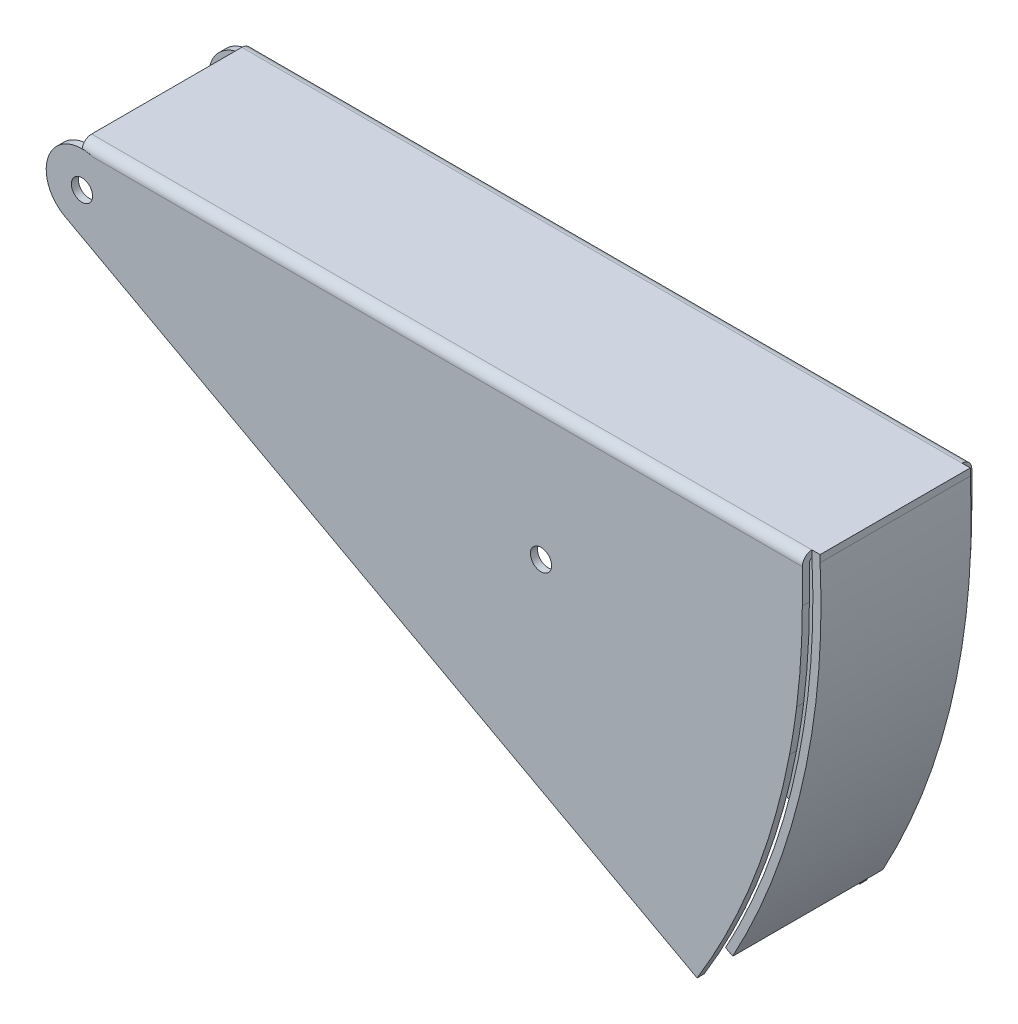
ISO-10303-21;
HEADER;
FILE_DESCRIPTION(('STEP AP214'),'2;1');
FILE_NAME('part.step','',(''),(''),'','','');
FILE_SCHEMA(('AUTOMOTIVE_DESIGN { 1 0 10303 214 1 1 1 1 }'));
ENDSEC;
DATA;
#1=APPLICATION_CONTEXT('core data for automotive mechanical design processes');
#2=APPLICATION_PROTOCOL_DEFINITION('international standard','automotive_design',2000,#1);
#3=PRODUCT_CONTEXT('',#1,'mechanical');
#4=PRODUCT('Part','Part','',(#3));
#5=PRODUCT_RELATED_PRODUCT_CATEGORY('part','',(#4));
#6=PRODUCT_DEFINITION_FORMATION('','',#4);
#7=PRODUCT_DEFINITION_CONTEXT('part definition',#1,'design');
#8=PRODUCT_DEFINITION('design','',#6,#7);
#9=PRODUCT_DEFINITION_SHAPE('','',#8);
#10=(LENGTH_UNIT() NAMED_UNIT(*) SI_UNIT(.MILLI.,.METRE.));
#11=(NAMED_UNIT(*) PLANE_ANGLE_UNIT() SI_UNIT($,.RADIAN.));
#12=(NAMED_UNIT(*) SI_UNIT($,.STERADIAN.) SOLID_ANGLE_UNIT());
#13=UNCERTAINTY_MEASURE_WITH_UNIT(LENGTH_MEASURE(1.E-05),#10,'distance_accuracy_value','');
#14=(GEOMETRIC_REPRESENTATION_CONTEXT(3) GLOBAL_UNCERTAINTY_ASSIGNED_CONTEXT((#13)) GLOBAL_UNIT_ASSIGNED_CONTEXT((#10,
#11,#12)) REPRESENTATION_CONTEXT('',''));
#15=CARTESIAN_POINT('',(0.,0.,0.));
#16=DIRECTION('',(0.,0.,1.));
#17=DIRECTION('',(1.,0.,0.));
#18=AXIS2_PLACEMENT_3D('',#15,#16,#17);
#19=CARTESIAN_POINT('',(0.,-2.,0.));
#20=DIRECTION('',(0.,-1.,0.));
#21=DIRECTION('',(0.,0.,-1.));
#22=AXIS2_PLACEMENT_3D('',#19,#20,#21);
#23=PLANE('',#22);
#24=DIRECTION('',(0.,0.,-1.));
#25=VECTOR('',#24,1.);
#26=CARTESIAN_POINT('',(134.,-2.,134.559141912843));
#27=LINE('',#26,#25);
#28=CARTESIAN_POINT('',(134.,-1.99999999999906,21.2634));
#29=VERTEX_POINT('',#28);
#30=CARTESIAN_POINT('',(134.,-1.99999999999973,-21.2634));
#31=VERTEX_POINT('',#30);
#32=EDGE_CURVE('E258',#29,#31,#27,.T.);
#33=ORIENTED_EDGE('',*,*,#32,.F.);
#34=DIRECTION('',(-1.,0.,0.));
#35=VECTOR('',#34,1.);
#36=CARTESIAN_POINT('',(-70.,-2.,21.2634));
#37=LINE('',#36,#35);
#38=CARTESIAN_POINT('',(-70.,-2.,21.2634));
#39=VERTEX_POINT('',#38);
#40=EDGE_CURVE('E509',#39,#29,#37,.F.);
#41=ORIENTED_EDGE('',*,*,#40,.F.);
#42=DIRECTION('',(0.,0.,1.));
#43=VECTOR('',#42,1.);
#44=CARTESIAN_POINT('',(-70.,-2.,-24.));
#45=LINE('',#44,#43);
#46=CARTESIAN_POINT('',(-70.,-2.00000000000001,-21.2634));
#47=VERTEX_POINT('',#46);
#48=EDGE_CURVE('E517',#47,#39,#45,.T.);
#49=ORIENTED_EDGE('',*,*,#48,.F.);
#50=DIRECTION('',(1.,0.,0.));
#51=VECTOR('',#50,1.);
#52=CARTESIAN_POINT('',(70.,-2.00000000000001,-21.2634));
#53=LINE('',#52,#51);
#54=EDGE_CURVE('E489',#31,#47,#53,.F.);
#55=ORIENTED_EDGE('',*,*,#54,.F.);
#56=EDGE_LOOP('',(#33,#41,#49,#55));
#57=FACE_BOUND('',#56,.T.);
#58=ADVANCED_FACE('F81',(#57),#23,.T.);
#59=CARTESIAN_POINT('',(0.,0.,0.));
#60=DIRECTION('',(0.,-1.,0.));
#61=DIRECTION('',(0.,0.,-1.));
#62=AXIS2_PLACEMENT_3D('',#59,#60,#61);
#63=PLANE('',#62);
#64=DIRECTION('',(0.,0.,-1.));
#65=VECTOR('',#64,1.);
#66=CARTESIAN_POINT('',(136.301141627899,0.,0.));
#67=LINE('',#66,#65);
#68=CARTESIAN_POINT('',(136.301141627899,0.,21.2634));
#69=VERTEX_POINT('',#68);
#70=CARTESIAN_POINT('',(136.301141627899,0.,-21.2634));
#71=VERTEX_POINT('',#70);
#72=EDGE_CURVE('E276',#69,#71,#67,.T.);
#73=ORIENTED_EDGE('',*,*,#72,.T.);
#74=DIRECTION('',(-1.,0.,0.));
#75=VECTOR('',#74,1.);
#76=CARTESIAN_POINT('',(70.,0.,-21.2634));
#77=LINE('',#76,#75);
#78=CARTESIAN_POINT('',(134.,0.,-21.2634));
#79=VERTEX_POINT('',#78);
#80=EDGE_CURVE('E365',#71,#79,#77,.T.);
#81=ORIENTED_EDGE('',*,*,#80,.T.);
#82=DIRECTION('',(1.,0.,0.));
#83=VECTOR('',#82,1.);
#84=CARTESIAN_POINT('',(70.,0.,-21.2634));
#85=LINE('',#84,#83);
#86=CARTESIAN_POINT('',(-70.,0.,-21.2634));
#87=VERTEX_POINT('',#86);
#88=EDGE_CURVE('E479',#79,#87,#85,.F.);
#89=ORIENTED_EDGE('',*,*,#88,.T.);
#90=DIRECTION('',(0.,0.,1.));
#91=VECTOR('',#90,1.);
#92=CARTESIAN_POINT('',(-70.,0.,-24.));
#93=LINE('',#92,#91);
#94=CARTESIAN_POINT('',(-70.,0.,21.2634));
#95=VERTEX_POINT('',#94);
#96=EDGE_CURVE('E516',#87,#95,#93,.T.);
#97=ORIENTED_EDGE('',*,*,#96,.T.);
#98=DIRECTION('',(-1.,0.,0.));
#99=VECTOR('',#98,1.);
#100=CARTESIAN_POINT('',(-70.,0.,21.2634));
#101=LINE('',#100,#99);
#102=CARTESIAN_POINT('',(134.,0.,21.2634));
#103=VERTEX_POINT('',#102);
#104=EDGE_CURVE('E504',#95,#103,#101,.F.);
#105=ORIENTED_EDGE('',*,*,#104,.T.);
#106=DIRECTION('',(1.,0.,0.));
#107=VECTOR('',#106,1.);
#108=CARTESIAN_POINT('',(70.,0.,21.2634));
#109=LINE('',#108,#107);
#110=EDGE_CURVE('E364',#103,#69,#109,.T.);
#111=ORIENTED_EDGE('',*,*,#110,.T.);
#112=EDGE_LOOP('',(#73,#81,#89,#97,#105,#111));
#113=FACE_BOUND('',#112,.T.);
#114=ADVANCED_FACE('F453',(#113),#63,.F.);
#115=CARTESIAN_POINT('',(70.,-92.6009311113302,21.2634));
#116=DIRECTION('',(0.,0.,1.));
#117=DIRECTION('',(1.,0.,0.));
#118=AXIS2_PLACEMENT_3D('',#115,#116,#117);
#119=PLANE('',#118);
#120=ORIENTED_EDGE('',*,*,#110,.F.);
#121=DIRECTION('',(0.,1.,0.));
#122=VECTOR('',#121,1.);
#123=CARTESIAN_POINT('',(134.,-2.,21.2634));
#124=LINE('',#123,#122);
#125=EDGE_CURVE('E346',#29,#103,#124,.T.);
#126=ORIENTED_EDGE('',*,*,#125,.F.);
#127=CARTESIAN_POINT('',(-70.,-12.3683,21.2634));
#128=DIRECTION('',(0.,0.,1.));
#129=DIRECTION('',(1.,0.,0.));
#130=AXIS2_PLACEMENT_3D('',#127,#128,#129);
#131=CIRCLE('',#130,204.263314486204);
#132=CARTESIAN_POINT('',(109.535311002089,-109.787875796004,21.2634));
#133=VERTEX_POINT('',#132);
#134=EDGE_CURVE('E251',#133,#29,#131,.T.);
#135=ORIENTED_EDGE('',*,*,#134,.F.);
#136=DIRECTION('',(-0.87894055500707,0.47693133757792,0.));
#137=VECTOR('',#136,1.);
#138=CARTESIAN_POINT('',(109.535311002089,-109.787875796004,21.2634));
#139=LINE('',#138,#137);
#140=CARTESIAN_POINT('',(111.555299451258,-110.883963338519,21.2634));
#141=VERTEX_POINT('',#140);
#142=EDGE_CURVE('E249',#141,#133,#139,.T.);
#143=ORIENTED_EDGE('',*,*,#142,.F.);
#144=CARTESIAN_POINT('',(-70.,-12.3683,21.2634));
#145=DIRECTION('',(0.,0.,1.));
#146=DIRECTION('',(1.,0.,0.));
#147=AXIS2_PLACEMENT_3D('',#144,#145,#146);
#148=CIRCLE('',#147,206.56152275258);
#149=CARTESIAN_POINT('',(136.301141627899,-2.00000000000007,21.2634));
#150=VERTEX_POINT('',#149);
#151=EDGE_CURVE('E265',#150,#141,#148,.F.);
#152=ORIENTED_EDGE('',*,*,#151,.F.);
#153=DIRECTION('',(0.,-1.,0.));
#154=VECTOR('',#153,1.);
#155=CARTESIAN_POINT('',(136.301141627899,0.,21.2634));
#156=LINE('',#155,#154);
#157=EDGE_CURVE('E279',#150,#69,#156,.F.);
#158=ORIENTED_EDGE('',*,*,#157,.T.);
#159=EDGE_LOOP('',(#120,#126,#135,#143,#152,#158));
#160=FACE_BOUND('',#159,.T.);
#161=ADVANCED_FACE('F456',(#160),#119,.T.);
#162=CARTESIAN_POINT('',(70.,-92.6009311113302,-21.2634));
#163=DIRECTION('',(0.,0.,-1.));
#164=DIRECTION('',(-1.,0.,0.));
#165=AXIS2_PLACEMENT_3D('',#162,#163,#164);
#166=PLANE('',#165);
#167=CARTESIAN_POINT('',(-70.,-12.3683,-21.2634));
#168=DIRECTION('',(0.,0.,1.));
#169=DIRECTION('',(-1.,0.,0.));
#170=AXIS2_PLACEMENT_3D('',#167,#168,#169);
#171=CIRCLE('',#170,204.263314486204);
#172=CARTESIAN_POINT('',(109.535311002089,-109.787875796004,-21.2634));
#173=VERTEX_POINT('',#172);
#174=EDGE_CURVE('E255',#173,#31,#171,.T.);
#175=ORIENTED_EDGE('',*,*,#174,.T.);
#176=DIRECTION('',(0.,-1.,0.));
#177=VECTOR('',#176,1.);
#178=CARTESIAN_POINT('',(134.,0.,-21.2634));
#179=LINE('',#178,#177);
#180=EDGE_CURVE('E362',#79,#31,#179,.T.);
#181=ORIENTED_EDGE('',*,*,#180,.F.);
#182=ORIENTED_EDGE('',*,*,#80,.F.);
#183=DIRECTION('',(0.,-1.,0.));
#184=VECTOR('',#183,1.);
#185=CARTESIAN_POINT('',(136.301141627899,0.,-21.2634));
#186=LINE('',#185,#184);
#187=CARTESIAN_POINT('',(136.301141627899,-2.,-21.2634));
#188=VERTEX_POINT('',#187);
#189=EDGE_CURVE('E281',#188,#71,#186,.F.);
#190=ORIENTED_EDGE('',*,*,#189,.F.);
#191=CARTESIAN_POINT('',(-70.,-12.3683,-21.2634));
#192=DIRECTION('',(0.,0.,-1.));
#193=DIRECTION('',(-1.,0.,0.));
#194=AXIS2_PLACEMENT_3D('',#191,#192,#193);
#195=CIRCLE('',#194,206.56152275258);
#196=CARTESIAN_POINT('',(111.555299451258,-110.883963338519,-21.2634));
#197=VERTEX_POINT('',#196);
#198=EDGE_CURVE('E96',#188,#197,#195,.T.);
#199=ORIENTED_EDGE('',*,*,#198,.T.);
#200=DIRECTION('',(-0.87894055500707,0.47693133757792,0.));
#201=VECTOR('',#200,1.);
#202=CARTESIAN_POINT('',(109.535311002089,-109.787875796004,-21.2634));
#203=LINE('',#202,#201);
#204=EDGE_CURVE('E247',#197,#173,#203,.T.);
#205=ORIENTED_EDGE('',*,*,#204,.T.);
#206=EDGE_LOOP('',(#175,#181,#182,#190,#199,#205));
#207=FACE_BOUND('',#206,.T.);
#208=ADVANCED_FACE('F263',(#207),#166,.T.);
#209=CARTESIAN_POINT('',(-70.,-12.3683,-221.668956114734));
#210=DIRECTION('',(0.,0.,1.));
#211=DIRECTION('',(1.,0.,0.));
#212=AXIS2_PLACEMENT_3D('',#209,#210,#211);
#213=CYLINDRICAL_SURFACE('',#212,204.);
#214=CARTESIAN_POINT('',(-70.,-12.3683,24.));
#215=DIRECTION('',(0.,0.,1.));
#216=DIRECTION('',(1.,0.,0.));
#217=AXIS2_PLACEMENT_3D('',#214,#215,#216);
#218=CIRCLE('',#217,204.);
#219=CARTESIAN_POINT('',(130.366665775417,-50.6984349598753,24.));
#220=VERTEX_POINT('',#219);
#221=CARTESIAN_POINT('',(132.383339124321,-37.9999999999999,24.));
#222=VERTEX_POINT('',#221);
#223=EDGE_CURVE('E324',#220,#222,#218,.T.);
#224=ORIENTED_EDGE('',*,*,#223,.F.);
#225=DIRECTION('',(0.,0.,1.));
#226=VECTOR('',#225,1.);
#227=CARTESIAN_POINT('',(130.366665775417,-50.6984349598753,-221.668956114734));
#228=LINE('',#227,#226);
#229=CARTESIAN_POINT('',(130.366665775417,-50.6984349598753,22.0000000000002));
#230=VERTEX_POINT('',#229);
#231=EDGE_CURVE('E89',#220,#230,#228,.F.);
#232=ORIENTED_EDGE('',*,*,#231,.T.);
#233=CARTESIAN_POINT('',(-70.,-12.3683,22.));
#234=DIRECTION('',(0.,0.,-1.));
#235=DIRECTION('',(0.,1.,0.));
#236=AXIS2_PLACEMENT_3D('',#233,#234,#235);
#237=CIRCLE('',#236,204.);
#238=CARTESIAN_POINT('',(132.383339124321,-37.9999999999998,22.0000000000001));
#239=VERTEX_POINT('',#238);
#240=EDGE_CURVE('E320',#230,#239,#237,.F.);
#241=ORIENTED_EDGE('',*,*,#240,.T.);
#242=DIRECTION('',(0.,0.,1.));
#243=VECTOR('',#242,1.);
#244=CARTESIAN_POINT('',(132.383339124321,-38.,-221.668956114734));
#245=LINE('',#244,#243);
#246=EDGE_CURVE('E334',#222,#239,#245,.F.);
#247=ORIENTED_EDGE('',*,*,#246,.F.);
#248=EDGE_LOOP('',(#224,#232,#241,#247));
#249=FACE_BOUND('',#248,.T.);
#250=ADVANCED_FACE('F529',(#249),#213,.T.);
#251=CARTESIAN_POINT('',(-70.,-12.3683000000009,221.668956114734));
#252=DIRECTION('',(0.,0.,-1.));
#253=DIRECTION('',(0.,1.,0.));
#254=AXIS2_PLACEMENT_3D('',#251,#252,#253);
#255=CYLINDRICAL_SURFACE('',#254,204.);
#256=CARTESIAN_POINT('',(-70.,-12.3683,-22.));
#257=DIRECTION('',(0.,0.,1.));
#258=DIRECTION('',(0.,-1.,0.));
#259=AXIS2_PLACEMENT_3D('',#256,#257,#258);
#260=CIRCLE('',#259,204.);
#261=CARTESIAN_POINT('',(132.383339124321,-38.0000000000036,-22.0000000000001));
#262=VERTEX_POINT('',#261);
#263=CARTESIAN_POINT('',(130.366665775417,-50.6984349598761,-22.0000000000002));
#264=VERTEX_POINT('',#263);
#265=EDGE_CURVE('E307',#262,#264,#260,.F.);
#266=ORIENTED_EDGE('',*,*,#265,.T.);
#267=DIRECTION('',(0.,0.,-1.));
#268=VECTOR('',#267,1.);
#269=CARTESIAN_POINT('',(130.366665775417,-50.698434959877,221.668956114734));
#270=LINE('',#269,#268);
#271=CARTESIAN_POINT('',(130.366665775417,-50.6984349598761,-24.0000000000002));
#272=VERTEX_POINT('',#271);
#273=EDGE_CURVE('E519',#264,#272,#270,.T.);
#274=ORIENTED_EDGE('',*,*,#273,.T.);
#275=CARTESIAN_POINT('',(-70.,-12.3683,-24.));
#276=DIRECTION('',(0.,0.,-1.));
#277=DIRECTION('',(0.,1.,0.));
#278=AXIS2_PLACEMENT_3D('',#275,#276,#277);
#279=CIRCLE('',#278,204.);
#280=CARTESIAN_POINT('',(132.383339124321,-37.9999999999998,-24.0000000000001));
#281=VERTEX_POINT('',#280);
#282=EDGE_CURVE('E300',#281,#272,#279,.T.);
#283=ORIENTED_EDGE('',*,*,#282,.F.);
#284=DIRECTION('',(0.,0.,-1.));
#285=VECTOR('',#284,1.);
#286=CARTESIAN_POINT('',(132.383339124321,-38.0000000000007,221.668956114734));
#287=LINE('',#286,#285);
#288=EDGE_CURVE('E316',#262,#281,#287,.T.);
#289=ORIENTED_EDGE('',*,*,#288,.F.);
#290=EDGE_LOOP('',(#266,#274,#283,#289));
#291=FACE_BOUND('',#290,.T.);
#292=ADVANCED_FACE('F412',(#291),#255,.T.);
#293=CARTESIAN_POINT('',(-70.,-12.3683000000001,6.65677509979093));
#294=DIRECTION('',(0.,0.,-1.));
#295=DIRECTION('',(0.,1.,0.));
#296=AXIS2_PLACEMENT_3D('',#293,#294,#295);
#297=CYLINDRICAL_SURFACE('',#296,10.1317);
#298=CARTESIAN_POINT('',(-70.,-2.23659999999999,-23.9539351809631));
#299=CARTESIAN_POINT('',(-69.8663864796928,-2.23659836372225,-23.9539177257458));
#300=CARTESIAN_POINT('',(-69.7327738709606,-2.23924301081691,-23.9544257852082));
#301=CARTESIAN_POINT('',(-69.4657691384989,-2.24981278616937,-23.9563670109434));
#302=CARTESIAN_POINT('',(-69.3323770068867,-2.2577377213591,-23.9578001433918));
#303=CARTESIAN_POINT('',(-69.0668454308715,-2.27879070929728,-23.9614542791932));
#304=CARTESIAN_POINT('',(-68.9347033403358,-2.29188629195634,-23.9636703569228));
#305=CARTESIAN_POINT('',(-68.6710450847787,-2.3232590152002,-23.9686509300969));
#306=CARTESIAN_POINT('',(-68.5395289261182,-2.34153620832792,-23.9714154311025));
#307=CARTESIAN_POINT('',(-68.2773266736152,-2.38324300277147,-23.9771725177905));
#308=CARTESIAN_POINT('',(-68.1466405470924,-2.4066723999225,-23.980165094432));
#309=CARTESIAN_POINT('',(-67.8862878248197,-2.45864877214075,-23.9859732449879));
#310=CARTESIAN_POINT('',(-67.7566212158498,-2.48719568073438,-23.9887888212009));
#311=CARTESIAN_POINT('',(-67.4976909742398,-2.54956098424253,-23.9937820280682));
#312=CARTESIAN_POINT('',(-67.3684349077494,-2.58341116817791,-23.9959555674211));
#313=CARTESIAN_POINT('',(-67.1113418774216,-2.65620149481315,-23.9990575954054));
#314=CARTESIAN_POINT('',(-66.9835049952705,-2.69514192886915,-23.9999860127342));
#315=CARTESIAN_POINT('',(-66.8564828615069,-2.73659999999998,-24.));
#316=B_SPLINE_CURVE_WITH_KNOTS('',3,(#298,#299,#300,#301,#302,#303,#304,#305,#306,#307,#308,
#309,#310,#311,#312,#313,#314,#315),.UNSPECIFIED.,.F.,.F.,(4,2,2,2,2,2,2,2,4),(0.,
0.400812014882311,0.801609375307859,1.19992888938143,1.59825244266572,1.9965602145495,
2.39486281301526,2.79565134596353,3.19646282933117),.UNSPECIFIED.);
#317=CARTESIAN_POINT('',(-70.,-2.23659999999999,-23.9539351809631));
#318=VERTEX_POINT('',#317);
#319=CARTESIAN_POINT('',(-66.8564828615069,-2.73659999999999,-24.));
#320=VERTEX_POINT('',#319);
#321=EDGE_CURVE('E393',#318,#320,#316,.T.);
#322=ORIENTED_EDGE('',*,*,#321,.T.);
#323=CARTESIAN_POINT('',(-70.,-12.3683,-24.));
#324=DIRECTION('',(0.,0.,-1.));
#325=DIRECTION('',(0.,1.,0.));
#326=AXIS2_PLACEMENT_3D('',#323,#324,#325);
#327=CIRCLE('',#326,10.1317);
#328=CARTESIAN_POINT('',(-74.8359122898312,-21.2714060431211,-24.0000000000001));
#329=VERTEX_POINT('',#328);
#330=EDGE_CURVE('E389',#329,#320,#327,.T.);
#331=ORIENTED_EDGE('',*,*,#330,.F.);
#332=DIRECTION('',(0.,0.,-1.));
#333=VECTOR('',#332,1.);
#334=CARTESIAN_POINT('',(-74.8359122898312,-21.2714060431218,221.668956114734));
#335=LINE('',#334,#333);
#336=CARTESIAN_POINT('',(-74.8359122898312,-21.2714060431211,-22.0000000000001));
#337=VERTEX_POINT('',#336);
#338=EDGE_CURVE('E306',#337,#329,#335,.T.);
#339=ORIENTED_EDGE('',*,*,#338,.F.);
#340=CARTESIAN_POINT('',(-70.,-12.3683,-22.));
#341=DIRECTION('',(0.,0.,1.));
#342=DIRECTION('',(0.,-1.,0.));
#343=AXIS2_PLACEMENT_3D('',#340,#341,#342);
#344=CIRCLE('',#343,10.1317);
#345=CARTESIAN_POINT('',(-70.,-2.23659999999999,-22.));
#346=VERTEX_POINT('',#345);
#347=EDGE_CURVE('E391',#337,#346,#344,.F.);
#348=ORIENTED_EDGE('',*,*,#347,.T.);
#349=DIRECTION('',(0.,0.,-1.));
#350=VECTOR('',#349,1.);
#351=CARTESIAN_POINT('',(-70.,-2.2366000000001,6.65677509979097));
#352=LINE('',#351,#350);
#353=EDGE_CURVE('E401',#346,#318,#352,.T.);
#354=ORIENTED_EDGE('',*,*,#353,.T.);
#355=EDGE_LOOP('',(#322,#331,#339,#348,#354));
#356=FACE_BOUND('',#355,.T.);
#357=ADVANCED_FACE('F407',(#356),#297,.T.);
#358=CARTESIAN_POINT('',(-70.,-2.,-24.));
#359=DIRECTION('',(-1.,0.,0.));
#360=DIRECTION('',(0.,0.,1.));
#361=AXIS2_PLACEMENT_3D('',#358,#359,#360);
#362=PLANE('',#361);
#363=DIRECTION('',(0.,1.,0.));
#364=VECTOR('',#363,1.);
#365=CARTESIAN_POINT('',(-70.,-2.00000000000001,-21.2634));
#366=LINE('',#365,#364);
#367=EDGE_CURVE('E486',#47,#87,#366,.T.);
#368=ORIENTED_EDGE('',*,*,#367,.F.);
#369=ORIENTED_EDGE('',*,*,#48,.T.);
#370=DIRECTION('',(0.,1.,0.));
#371=VECTOR('',#370,1.);
#372=CARTESIAN_POINT('',(-70.,-2.,21.2634));
#373=LINE('',#372,#371);
#374=EDGE_CURVE('E506',#39,#95,#373,.T.);
#375=ORIENTED_EDGE('',*,*,#374,.T.);
#376=ORIENTED_EDGE('',*,*,#96,.F.);
#377=EDGE_LOOP('',(#368,#369,#375,#376));
#378=FACE_BOUND('',#377,.T.);
#379=ADVANCED_FACE('F83',(#378),#362,.T.);
#380=CARTESIAN_POINT('',(-70.,-2.73659999999999,21.2634));
#381=DIRECTION('',(1.,0.,0.));
#382=DIRECTION('',(0.,0.,-1.));
#383=AXIS2_PLACEMENT_3D('',#380,#381,#382);
#384=PLANE('',#383);
#385=DIRECTION('',(0.,1.,0.));
#386=VECTOR('',#385,1.);
#387=CARTESIAN_POINT('',(-70.,-2.73659999999999,22.));
#388=LINE('',#387,#386);
#389=CARTESIAN_POINT('',(-70.,-2.23659999999999,22.));
#390=VERTEX_POINT('',#389);
#391=CARTESIAN_POINT('',(-70.,-2.73659999999999,22.));
#392=VERTEX_POINT('',#391);
#393=EDGE_CURVE('E549',#390,#392,#388,.F.);
#394=ORIENTED_EDGE('',*,*,#393,.F.);
#395=DIRECTION('',(0.,0.,1.));
#396=VECTOR('',#395,1.);
#397=CARTESIAN_POINT('',(-70.,-2.23659999999999,-6.65677509979092));
#398=LINE('',#397,#396);
#399=CARTESIAN_POINT('',(-70.,-2.23659999999999,23.9539351809631));
#400=VERTEX_POINT('',#399);
#401=EDGE_CURVE('E431',#400,#390,#398,.F.);
#402=ORIENTED_EDGE('',*,*,#401,.F.);
#403=CARTESIAN_POINT('',(-70.,-2.73659999999999,21.2634));
#404=DIRECTION('',(-1.,0.,0.));
#405=DIRECTION('',(0.,0.,1.));
#406=AXIS2_PLACEMENT_3D('',#403,#404,#405);
#407=CIRCLE('',#406,2.73659999999999);
#408=EDGE_CURVE('E507',#400,#95,#407,.T.);
#409=ORIENTED_EDGE('',*,*,#408,.T.);
#410=ORIENTED_EDGE('',*,*,#374,.F.);
#411=CARTESIAN_POINT('',(-70.,-2.73659999999999,21.2634));
#412=DIRECTION('',(-1.,0.,0.));
#413=DIRECTION('',(0.,0.,1.));
#414=AXIS2_PLACEMENT_3D('',#411,#412,#413);
#415=CIRCLE('',#414,0.73659999999999);
#416=EDGE_CURVE('E502',#392,#39,#415,.T.);
#417=ORIENTED_EDGE('',*,*,#416,.F.);
#418=EDGE_LOOP('',(#394,#402,#409,#410,#417));
#419=FACE_BOUND('',#418,.T.);
#420=ADVANCED_FACE('F441',(#419),#384,.F.);
#421=CARTESIAN_POINT('',(-70.,-2.73659999999999,21.2634));
#422=DIRECTION('',(-1.,0.,0.));
#423=DIRECTION('',(0.,0.,1.));
#424=AXIS2_PLACEMENT_3D('',#421,#422,#423);
#425=CYLINDRICAL_SURFACE('',#424,2.73659999999999);
#426=CARTESIAN_POINT('',(-66.8564828615069,-2.73659999999999,24.));
#427=CARTESIAN_POINT('',(-66.9835049952704,-2.69514192886916,23.9999860127342));
#428=CARTESIAN_POINT('',(-67.1113418774216,-2.65620149481316,23.9990575954054));
#429=CARTESIAN_POINT('',(-67.3684349077493,-2.58341116817792,23.9959555674211));
#430=CARTESIAN_POINT('',(-67.4976909742398,-2.54956098424254,23.9937820280682));
#431=CARTESIAN_POINT('',(-67.7566212158498,-2.48719568073438,23.9887888212009));
#432=CARTESIAN_POINT('',(-67.8862878248197,-2.45864877214075,23.9859732449879));
#433=CARTESIAN_POINT('',(-68.1466405470924,-2.4066723999225,23.980165094432));
#434=CARTESIAN_POINT('',(-68.2773266736153,-2.38324300277147,23.9771725177905));
#435=CARTESIAN_POINT('',(-68.5395289261182,-2.34153620832793,23.9714154311025));
#436=CARTESIAN_POINT('',(-68.6710450847787,-2.32325901520021,23.9686509300969));
#437=CARTESIAN_POINT('',(-68.9347033403358,-2.29188629195635,23.9636703569228));
#438=CARTESIAN_POINT('',(-69.0668454308715,-2.27879070929729,23.9614542791932));
#439=CARTESIAN_POINT('',(-69.3323770068867,-2.25773772135911,23.9578001433918));
#440=CARTESIAN_POINT('',(-69.4657691384989,-2.24981278616937,23.9563670109434));
#441=CARTESIAN_POINT('',(-69.7327738709606,-2.23924301081692,23.9544257852082));
#442=CARTESIAN_POINT('',(-69.8663864796928,-2.23659836372226,23.9539177257458));
#443=CARTESIAN_POINT('',(-70.,-2.23659999999999,23.9539351809631));
#444=B_SPLINE_CURVE_WITH_KNOTS('',3,(#426,#427,#428,#429,#430,#431,#432,#433,#434,#435,#436,
#437,#438,#439,#440,#441,#442,#443),.UNSPECIFIED.,.F.,.F.,(4,2,2,2,2,2,2,2,4),(0.,
0.40081148336764,0.801600016315932,1.19990261478169,1.59821038666546,1.99653393994975,
2.39485345402334,2.7956508144489,3.1964628293312),.UNSPECIFIED.);
#445=CARTESIAN_POINT('',(-66.8564828615069,-2.73659999999999,24.));
#446=VERTEX_POINT('',#445);
#447=EDGE_CURVE('E424',#446,#400,#444,.T.);
#448=ORIENTED_EDGE('',*,*,#447,.F.);
#449=DIRECTION('',(-1.,0.,0.));
#450=VECTOR('',#449,1.);
#451=CARTESIAN_POINT('',(70.,-2.7366,24.));
#452=LINE('',#451,#450);
#453=CARTESIAN_POINT('',(134.,-2.73659999999998,24.));
#454=VERTEX_POINT('',#453);
#455=EDGE_CURVE('E500',#446,#454,#452,.F.);
#456=ORIENTED_EDGE('',*,*,#455,.T.);
#457=CARTESIAN_POINT('',(134.,-2.73659999999999,21.2634));
#458=DIRECTION('',(1.,0.,0.));
#459=DIRECTION('',(0.,0.,-1.));
#460=AXIS2_PLACEMENT_3D('',#457,#458,#459);
#461=CIRCLE('',#460,2.73659999999999);
#462=EDGE_CURVE('E343',#103,#454,#461,.T.);
#463=ORIENTED_EDGE('',*,*,#462,.F.);
#464=ORIENTED_EDGE('',*,*,#104,.F.);
#465=ORIENTED_EDGE('',*,*,#408,.F.);
#466=EDGE_LOOP('',(#448,#456,#463,#464,#465));
#467=FACE_BOUND('',#466,.T.);
#468=ADVANCED_FACE('F435',(#467),#425,.T.);
#469=CARTESIAN_POINT('',(-70.,-2.73659999999999,21.2634));
#470=DIRECTION('',(-1.,0.,0.));
#471=DIRECTION('',(0.,0.,1.));
#472=AXIS2_PLACEMENT_3D('',#469,#470,#471);
#473=CYLINDRICAL_SURFACE('',#472,0.73659999999999);
#474=ORIENTED_EDGE('',*,*,#40,.T.);
#475=CARTESIAN_POINT('',(134.,-2.73659999999999,21.2634));
#476=DIRECTION('',(1.,0.,0.));
#477=DIRECTION('',(0.,0.,-1.));
#478=AXIS2_PLACEMENT_3D('',#475,#476,#477);
#479=CIRCLE('',#478,0.736599999999991);
#480=CARTESIAN_POINT('',(134.,-2.73659999999999,22.));
#481=VERTEX_POINT('',#480);
#482=EDGE_CURVE('E348',#481,#29,#479,.F.);
#483=ORIENTED_EDGE('',*,*,#482,.F.);
#484=DIRECTION('',(-1.,0.,0.));
#485=VECTOR('',#484,1.);
#486=CARTESIAN_POINT('',(70.,-2.7366,22.));
#487=LINE('',#486,#485);
#488=EDGE_CURVE('E499',#481,#392,#487,.T.);
#489=ORIENTED_EDGE('',*,*,#488,.T.);
#490=ORIENTED_EDGE('',*,*,#416,.T.);
#491=EDGE_LOOP('',(#474,#483,#489,#490));
#492=FACE_BOUND('',#491,.T.);
#493=ADVANCED_FACE('F440',(#492),#473,.F.);
#494=CARTESIAN_POINT('',(0.,0.,24.));
#495=DIRECTION('',(0.,0.,-1.));
#496=DIRECTION('',(0.,1.,0.));
#497=AXIS2_PLACEMENT_3D('',#494,#495,#496);
#498=PLANE('',#497);
#499=ORIENTED_EDGE('',*,*,#223,.T.);
#500=CARTESIAN_POINT('',(-70.,-12.3683000000002,24.));
#501=DIRECTION('',(0.,0.,-1.));
#502=DIRECTION('',(0.,1.,0.));
#503=AXIS2_PLACEMENT_3D('',#500,#501,#502);
#504=CIRCLE('',#503,204.);
#505=CARTESIAN_POINT('',(134.,-12.3683000000002,24.));
#506=VERTEX_POINT('',#505);
#507=EDGE_CURVE('E290',#222,#506,#504,.F.);
#508=ORIENTED_EDGE('',*,*,#507,.T.);
#509=DIRECTION('',(0.,-1.,0.));
#510=VECTOR('',#509,1.);
#511=CARTESIAN_POINT('',(134.,-2.73659999999998,24.));
#512=LINE('',#511,#510);
#513=EDGE_CURVE('E339',#454,#506,#512,.T.);
#514=ORIENTED_EDGE('',*,*,#513,.F.);
#515=ORIENTED_EDGE('',*,*,#455,.F.);
#516=CARTESIAN_POINT('',(-70.,-12.3683,24.));
#517=DIRECTION('',(0.,0.,1.));
#518=DIRECTION('',(1.,0.,0.));
#519=AXIS2_PLACEMENT_3D('',#516,#517,#518);
#520=CIRCLE('',#519,10.1317);
#521=CARTESIAN_POINT('',(-74.8359122898312,-21.2714060431211,24.));
#522=VERTEX_POINT('',#521);
#523=EDGE_CURVE('E551',#446,#522,#520,.T.);
#524=ORIENTED_EDGE('',*,*,#523,.T.);
#525=DIRECTION('',(0.878737629728586,-0.477305120545533,0.));
#526=VECTOR('',#525,1.);
#527=CARTESIAN_POINT('',(-25.9709109850423,-47.8134756543244,24.));
#528=LINE('',#527,#526);
#529=CARTESIAN_POINT('',(104.20534041752,-118.52148822351,24.));
#530=VERTEX_POINT('',#529);
#531=EDGE_CURVE('E328',#522,#530,#528,.T.);
#532=ORIENTED_EDGE('',*,*,#531,.T.);
#533=EDGE_CURVE('E325',#530,#220,#218,.T.);
#534=ORIENTED_EDGE('',*,*,#533,.T.);
#535=EDGE_LOOP('',(#499,#508,#514,#515,#524,#532,#534));
#536=FACE_BOUND('',#535,.T.);
#537=CARTESIAN_POINT('',(60.,-38.,24.));
#538=DIRECTION('',(0.,0.,1.));
#539=DIRECTION('',(1.,0.,0.));
#540=AXIS2_PLACEMENT_3D('',#537,#538,#539);
#541=CIRCLE('',#540,3.00000000000001);
#542=CARTESIAN_POINT('',(63.,-38.,24.));
#543=VERTEX_POINT('',#542);
#544=EDGE_CURVE('E370',#543,#543,#541,.T.);
#545=ORIENTED_EDGE('',*,*,#544,.F.);
#546=EDGE_LOOP('',(#545));
#547=FACE_BOUND('',#546,.T.);
#548=CARTESIAN_POINT('',(-70.,-12.3683,24.));
#549=DIRECTION('',(0.,0.,1.));
#550=DIRECTION('',(1.,0.,0.));
#551=AXIS2_PLACEMENT_3D('',#548,#549,#550);
#552=CIRCLE('',#551,3.00000000000001);
#553=CARTESIAN_POINT('',(-67.,-12.3683,24.));
#554=VERTEX_POINT('',#553);
#555=EDGE_CURVE('E367',#554,#554,#552,.T.);
#556=ORIENTED_EDGE('',*,*,#555,.F.);
#557=EDGE_LOOP('',(#556));
#558=FACE_BOUND('',#557,.T.);
#559=ADVANCED_FACE('F447',(#536,#547,#558),#498,.F.);
#560=CARTESIAN_POINT('',(0.,0.,22.));
#561=DIRECTION('',(0.,0.,-1.));
#562=DIRECTION('',(0.,1.,0.));
#563=AXIS2_PLACEMENT_3D('',#560,#561,#562);
#564=PLANE('',#563);
#565=CARTESIAN_POINT('',(-70.,-12.3683000000002,22.));
#566=DIRECTION('',(0.,0.,-1.));
#567=DIRECTION('',(0.,1.,0.));
#568=AXIS2_PLACEMENT_3D('',#565,#566,#567);
#569=CIRCLE('',#568,204.);
#570=CARTESIAN_POINT('',(134.,-12.3683000000003,22.));
#571=VERTEX_POINT('',#570);
#572=EDGE_CURVE('E288',#239,#571,#569,.F.);
#573=ORIENTED_EDGE('',*,*,#572,.F.);
#574=ORIENTED_EDGE('',*,*,#240,.F.);
#575=CARTESIAN_POINT('',(104.20534041752,-118.52148822351,22.0000000000004));
#576=VERTEX_POINT('',#575);
#577=EDGE_CURVE('E321',#576,#230,#237,.F.);
#578=ORIENTED_EDGE('',*,*,#577,.F.);
#579=DIRECTION('',(0.878737629728587,-0.477305120545533,0.));
#580=VECTOR('',#579,1.);
#581=CARTESIAN_POINT('',(-25.9709109850426,-47.8134756543242,22.0000000000002));
#582=LINE('',#581,#580);
#583=CARTESIAN_POINT('',(-74.8359122898312,-21.2714060431211,22.0000000000001));
#584=VERTEX_POINT('',#583);
#585=EDGE_CURVE('E299',#584,#576,#582,.T.);
#586=ORIENTED_EDGE('',*,*,#585,.F.);
#587=CARTESIAN_POINT('',(-70.,-12.3683,22.));
#588=DIRECTION('',(0.,0.,-1.));
#589=DIRECTION('',(0.,1.,0.));
#590=AXIS2_PLACEMENT_3D('',#587,#588,#589);
#591=CIRCLE('',#590,10.1317);
#592=EDGE_CURVE('E432',#390,#584,#591,.F.);
#593=ORIENTED_EDGE('',*,*,#592,.F.);
#594=ORIENTED_EDGE('',*,*,#393,.T.);
#595=ORIENTED_EDGE('',*,*,#488,.F.);
#596=DIRECTION('',(0.,1.,0.));
#597=VECTOR('',#596,1.);
#598=CARTESIAN_POINT('',(134.,-38.,22.0000000000001));
#599=LINE('',#598,#597);
#600=EDGE_CURVE('E338',#571,#481,#599,.T.);
#601=ORIENTED_EDGE('',*,*,#600,.F.);
#602=EDGE_LOOP('',(#573,#574,#578,#586,#593,#594,#595,#601));
#603=FACE_BOUND('',#602,.T.);
#604=CARTESIAN_POINT('',(60.,-38.,22.0000000000001));
#605=DIRECTION('',(0.,0.,-1.));
#606=DIRECTION('',(0.,1.,0.));
#607=AXIS2_PLACEMENT_3D('',#604,#605,#606);
#608=CIRCLE('',#607,3.00000000000001);
#609=CARTESIAN_POINT('',(60.,-35.,22.0000000000001));
#610=VERTEX_POINT('',#609);
#611=EDGE_CURVE('E386',#610,#610,#608,.T.);
#612=ORIENTED_EDGE('',*,*,#611,.F.);
#613=EDGE_LOOP('',(#612));
#614=FACE_BOUND('',#613,.T.);
#615=CARTESIAN_POINT('',(-70.,-12.3683,22.));
#616=DIRECTION('',(0.,0.,-1.));
#617=DIRECTION('',(0.,1.,0.));
#618=AXIS2_PLACEMENT_3D('',#615,#616,#617);
#619=CIRCLE('',#618,3.00000000000001);
#620=CARTESIAN_POINT('',(-70.,-9.36829999999999,22.));
#621=VERTEX_POINT('',#620);
#622=EDGE_CURVE('E379',#621,#621,#619,.T.);
#623=ORIENTED_EDGE('',*,*,#622,.F.);
#624=EDGE_LOOP('',(#623));
#625=FACE_BOUND('',#624,.T.);
#626=ADVANCED_FACE('F443',(#603,#614,#625),#564,.T.);
#627=CARTESIAN_POINT('',(-70.,-2.7366,-21.2634));
#628=DIRECTION('',(-1.,0.,0.));
#629=DIRECTION('',(0.,0.,1.));
#630=AXIS2_PLACEMENT_3D('',#627,#628,#629);
#631=PLANE('',#630);
#632=DIRECTION('',(0.,1.,0.));
#633=VECTOR('',#632,1.);
#634=CARTESIAN_POINT('',(-70.,-2.7366,-22.));
#635=LINE('',#634,#633);
#636=CARTESIAN_POINT('',(-70.,-2.73659999999999,-22.));
#637=VERTEX_POINT('',#636);
#638=EDGE_CURVE('E643',#637,#346,#635,.T.);
#639=ORIENTED_EDGE('',*,*,#638,.F.);
#640=CARTESIAN_POINT('',(-70.,-2.7366,-21.2634));
#641=DIRECTION('',(1.,0.,0.));
#642=DIRECTION('',(0.,0.,-1.));
#643=AXIS2_PLACEMENT_3D('',#640,#641,#642);
#644=CIRCLE('',#643,0.736599999999993);
#645=EDGE_CURVE('E484',#47,#637,#644,.F.);
#646=ORIENTED_EDGE('',*,*,#645,.F.);
#647=ORIENTED_EDGE('',*,*,#367,.T.);
#648=CARTESIAN_POINT('',(-70.,-2.7366,-21.2634));
#649=DIRECTION('',(1.,0.,0.));
#650=DIRECTION('',(0.,0.,-1.));
#651=AXIS2_PLACEMENT_3D('',#648,#649,#650);
#652=CIRCLE('',#651,2.73659999999999);
#653=EDGE_CURVE('E481',#87,#318,#652,.F.);
#654=ORIENTED_EDGE('',*,*,#653,.T.);
#655=ORIENTED_EDGE('',*,*,#353,.F.);
#656=EDGE_LOOP('',(#639,#646,#647,#654,#655));
#657=FACE_BOUND('',#656,.T.);
#658=ADVANCED_FACE('F627',(#657),#631,.T.);
#659=CARTESIAN_POINT('',(70.,-2.7366,-21.2634));
#660=DIRECTION('',(1.,0.,0.));
#661=DIRECTION('',(0.,0.,-1.));
#662=AXIS2_PLACEMENT_3D('',#659,#660,#661);
#663=CYLINDRICAL_SURFACE('',#662,2.73659999999999);
#664=ORIENTED_EDGE('',*,*,#321,.F.);
#665=ORIENTED_EDGE('',*,*,#653,.F.);
#666=ORIENTED_EDGE('',*,*,#88,.F.);
#667=CARTESIAN_POINT('',(134.,-2.7366,-21.2634));
#668=DIRECTION('',(1.,0.,0.));
#669=DIRECTION('',(0.,0.,-1.));
#670=AXIS2_PLACEMENT_3D('',#667,#668,#669);
#671=CIRCLE('',#670,2.7366);
#672=CARTESIAN_POINT('',(134.,-2.73659999999998,-24.));
#673=VERTEX_POINT('',#672);
#674=EDGE_CURVE('E359',#673,#79,#671,.T.);
#675=ORIENTED_EDGE('',*,*,#674,.F.);
#676=DIRECTION('',(1.,0.,0.));
#677=VECTOR('',#676,1.);
#678=CARTESIAN_POINT('',(-70.,-2.73659999999999,-24.));
#679=LINE('',#678,#677);
#680=EDGE_CURVE('E477',#673,#320,#679,.F.);
#681=ORIENTED_EDGE('',*,*,#680,.T.);
#682=EDGE_LOOP('',(#664,#665,#666,#675,#681));
#683=FACE_BOUND('',#682,.T.);
#684=ADVANCED_FACE('F403',(#683),#663,.T.);
#685=CARTESIAN_POINT('',(70.,-2.7366,-21.2634));
#686=DIRECTION('',(1.,0.,0.));
#687=DIRECTION('',(0.,0.,-1.));
#688=AXIS2_PLACEMENT_3D('',#685,#686,#687);
#689=CYLINDRICAL_SURFACE('',#688,0.736599999999993);
#690=ORIENTED_EDGE('',*,*,#54,.T.);
#691=ORIENTED_EDGE('',*,*,#645,.T.);
#692=DIRECTION('',(1.,0.,0.));
#693=VECTOR('',#692,1.);
#694=CARTESIAN_POINT('',(-70.,-2.7366,-22.));
#695=LINE('',#694,#693);
#696=CARTESIAN_POINT('',(134.,-2.7366,-22.));
#697=VERTEX_POINT('',#696);
#698=EDGE_CURVE('E492',#637,#697,#695,.T.);
#699=ORIENTED_EDGE('',*,*,#698,.T.);
#700=CARTESIAN_POINT('',(134.,-2.7366,-21.2634));
#701=DIRECTION('',(-1.,0.,0.));
#702=DIRECTION('',(0.,0.,-1.));
#703=AXIS2_PLACEMENT_3D('',#700,#701,#702);
#704=CIRCLE('',#703,0.736599999999993);
#705=EDGE_CURVE('E342',#31,#697,#704,.T.);
#706=ORIENTED_EDGE('',*,*,#705,.F.);
#707=EDGE_LOOP('',(#690,#691,#699,#706));
#708=FACE_BOUND('',#707,.T.);
#709=ADVANCED_FACE('F631',(#708),#689,.F.);
#710=CARTESIAN_POINT('',(0.,0.,-24.));
#711=DIRECTION('',(0.,0.,1.));
#712=DIRECTION('',(0.,-1.,0.));
#713=AXIS2_PLACEMENT_3D('',#710,#711,#712);
#714=PLANE('',#713);
#715=DIRECTION('',(0.,1.,0.));
#716=VECTOR('',#715,1.);
#717=CARTESIAN_POINT('',(134.,-37.9999999999998,-24.0000000000001));
#718=LINE('',#717,#716);
#719=CARTESIAN_POINT('',(134.,-12.3683,-24.));
#720=VERTEX_POINT('',#719);
#721=EDGE_CURVE('E357',#720,#673,#718,.T.);
#722=ORIENTED_EDGE('',*,*,#721,.F.);
#723=CARTESIAN_POINT('',(-70.,-12.3683,-24.));
#724=DIRECTION('',(0.,0.,1.));
#725=DIRECTION('',(0.,1.,0.));
#726=AXIS2_PLACEMENT_3D('',#723,#724,#725);
#727=CIRCLE('',#726,204.);
#728=EDGE_CURVE('E104',#281,#720,#727,.T.);
#729=ORIENTED_EDGE('',*,*,#728,.F.);
#730=ORIENTED_EDGE('',*,*,#282,.T.);
#731=CARTESIAN_POINT('',(104.20534041752,-118.52148822351,-24.0000000000004));
#732=VERTEX_POINT('',#731);
#733=EDGE_CURVE('E303',#272,#732,#279,.T.);
#734=ORIENTED_EDGE('',*,*,#733,.T.);
#735=DIRECTION('',(-0.878737629728587,0.477305120545532,0.));
#736=VECTOR('',#735,1.);
#737=CARTESIAN_POINT('',(104.20534041752,-118.52148822351,-24.0000000000004));
#738=LINE('',#737,#736);
#739=EDGE_CURVE('E296',#732,#329,#738,.T.);
#740=ORIENTED_EDGE('',*,*,#739,.T.);
#741=ORIENTED_EDGE('',*,*,#330,.T.);
#742=ORIENTED_EDGE('',*,*,#680,.F.);
#743=EDGE_LOOP('',(#722,#729,#730,#734,#740,#741,#742));
#744=FACE_BOUND('',#743,.T.);
#745=CARTESIAN_POINT('',(-70.,-12.3683,-24.));
#746=DIRECTION('',(0.,0.,1.));
#747=DIRECTION('',(0.,-1.,0.));
#748=AXIS2_PLACEMENT_3D('',#745,#746,#747);
#749=CIRCLE('',#748,3.00000000000001);
#750=CARTESIAN_POINT('',(-70.,-15.3683,-24.));
#751=VERTEX_POINT('',#750);
#752=EDGE_CURVE('E376',#751,#751,#749,.T.);
#753=ORIENTED_EDGE('',*,*,#752,.T.);
#754=EDGE_LOOP('',(#753));
#755=FACE_BOUND('',#754,.T.);
#756=CARTESIAN_POINT('',(60.,-38.,-24.0000000000001));
#757=DIRECTION('',(0.,0.,1.));
#758=DIRECTION('',(0.,-1.,0.));
#759=AXIS2_PLACEMENT_3D('',#756,#757,#758);
#760=CIRCLE('',#759,3.00000000000001);
#761=CARTESIAN_POINT('',(60.,-41.,-24.0000000000002));
#762=VERTEX_POINT('',#761);
#763=EDGE_CURVE('E383',#762,#762,#760,.T.);
#764=ORIENTED_EDGE('',*,*,#763,.T.);
#765=EDGE_LOOP('',(#764));
#766=FACE_BOUND('',#765,.T.);
#767=ADVANCED_FACE('F422',(#744,#755,#766),#714,.F.);
#768=CARTESIAN_POINT('',(0.,0.,-22.));
#769=DIRECTION('',(0.,0.,1.));
#770=DIRECTION('',(0.,-1.,0.));
#771=AXIS2_PLACEMENT_3D('',#768,#769,#770);
#772=PLANE('',#771);
#773=CARTESIAN_POINT('',(-70.,-12.3683,-22.));
#774=DIRECTION('',(0.,0.,1.));
#775=DIRECTION('',(0.,-1.,0.));
#776=AXIS2_PLACEMENT_3D('',#773,#774,#775);
#777=CIRCLE('',#776,204.);
#778=CARTESIAN_POINT('',(134.,-12.3683,-22.));
#779=VERTEX_POINT('',#778);
#780=EDGE_CURVE('E293',#779,#262,#777,.F.);
#781=ORIENTED_EDGE('',*,*,#780,.F.);
#782=DIRECTION('',(0.,-1.,0.));
#783=VECTOR('',#782,1.);
#784=CARTESIAN_POINT('',(134.,-2.7366,-22.));
#785=LINE('',#784,#783);
#786=EDGE_CURVE('E354',#697,#779,#785,.T.);
#787=ORIENTED_EDGE('',*,*,#786,.F.);
#788=ORIENTED_EDGE('',*,*,#698,.F.);
#789=ORIENTED_EDGE('',*,*,#638,.T.);
#790=ORIENTED_EDGE('',*,*,#347,.F.);
#791=DIRECTION('',(-0.878737629728587,0.477305120545532,0.));
#792=VECTOR('',#791,1.);
#793=CARTESIAN_POINT('',(104.20534041752,-118.52148822351,-22.0000000000004));
#794=LINE('',#793,#792);
#795=CARTESIAN_POINT('',(104.20534041752,-118.52148822351,-22.0000000000004));
#796=VERTEX_POINT('',#795);
#797=EDGE_CURVE('E295',#796,#337,#794,.T.);
#798=ORIENTED_EDGE('',*,*,#797,.F.);
#799=EDGE_CURVE('E311',#264,#796,#260,.F.);
#800=ORIENTED_EDGE('',*,*,#799,.F.);
#801=ORIENTED_EDGE('',*,*,#265,.F.);
#802=EDGE_LOOP('',(#781,#787,#788,#789,#790,#798,#800,#801));
#803=FACE_BOUND('',#802,.T.);
#804=CARTESIAN_POINT('',(60.,-38.,-22.0000000000001));
#805=DIRECTION('',(0.,0.,1.));
#806=DIRECTION('',(0.,-1.,0.));
#807=AXIS2_PLACEMENT_3D('',#804,#805,#806);
#808=CIRCLE('',#807,3.00000000000001);
#809=CARTESIAN_POINT('',(60.,-41.,-22.0000000000002));
#810=VERTEX_POINT('',#809);
#811=EDGE_CURVE('E382',#810,#810,#808,.T.);
#812=ORIENTED_EDGE('',*,*,#811,.F.);
#813=EDGE_LOOP('',(#812));
#814=FACE_BOUND('',#813,.T.);
#815=CARTESIAN_POINT('',(-70.,-12.3683,-22.));
#816=DIRECTION('',(0.,0.,1.));
#817=DIRECTION('',(0.,-1.,0.));
#818=AXIS2_PLACEMENT_3D('',#815,#816,#817);
#819=CIRCLE('',#818,3.00000000000001);
#820=CARTESIAN_POINT('',(-70.,-15.3683,-22.));
#821=VERTEX_POINT('',#820);
#822=EDGE_CURVE('E373',#821,#821,#819,.T.);
#823=ORIENTED_EDGE('',*,*,#822,.F.);
#824=EDGE_LOOP('',(#823));
#825=FACE_BOUND('',#824,.T.);
#826=ADVANCED_FACE('F420',(#803,#814,#825),#772,.T.);
#827=CARTESIAN_POINT('',(-70.,-12.3683,-6.65677509979092));
#828=DIRECTION('',(0.,0.,1.));
#829=DIRECTION('',(1.,0.,0.));
#830=AXIS2_PLACEMENT_3D('',#827,#828,#829);
#831=CYLINDRICAL_SURFACE('',#830,10.1317);
#832=DIRECTION('',(0.,0.,1.));
#833=VECTOR('',#832,1.);
#834=CARTESIAN_POINT('',(-74.8359122898312,-21.2714060431211,-221.668956114734));
#835=LINE('',#834,#833);
#836=EDGE_CURVE('E331',#584,#522,#835,.T.);
#837=ORIENTED_EDGE('',*,*,#836,.T.);
#838=ORIENTED_EDGE('',*,*,#523,.F.);
#839=ORIENTED_EDGE('',*,*,#447,.T.);
#840=ORIENTED_EDGE('',*,*,#401,.T.);
#841=ORIENTED_EDGE('',*,*,#592,.T.);
#842=EDGE_LOOP('',(#837,#838,#839,#840,#841));
#843=FACE_BOUND('',#842,.T.);
#844=ADVANCED_FACE('F416',(#843),#831,.T.);
#845=CARTESIAN_POINT('',(-70.,-12.3683,-92.));
#846=DIRECTION('',(0.,0.,1.));
#847=DIRECTION('',(1.,0.,0.));
#848=AXIS2_PLACEMENT_3D('',#845,#846,#847);
#849=CYLINDRICAL_SURFACE('',#848,3.00000000000001);
#850=ORIENTED_EDGE('',*,*,#822,.T.);
#851=EDGE_LOOP('',(#850));
#852=FACE_BOUND('',#851,.T.);
#853=ORIENTED_EDGE('',*,*,#752,.F.);
#854=EDGE_LOOP('',(#853));
#855=FACE_BOUND('',#854,.T.);
#856=ADVANCED_FACE('F414',(#852,#855),#849,.F.);
#857=CARTESIAN_POINT('',(60.,-38.,-92.));
#858=DIRECTION('',(0.,0.,1.));
#859=DIRECTION('',(1.,0.,0.));
#860=AXIS2_PLACEMENT_3D('',#857,#858,#859);
#861=CYLINDRICAL_SURFACE('',#860,3.00000000000001);
#862=ORIENTED_EDGE('',*,*,#811,.T.);
#863=EDGE_LOOP('',(#862));
#864=FACE_BOUND('',#863,.T.);
#865=ORIENTED_EDGE('',*,*,#763,.F.);
#866=EDGE_LOOP('',(#865));
#867=FACE_BOUND('',#866,.T.);
#868=ADVANCED_FACE('F602',(#864,#867),#861,.F.);
#869=ORIENTED_EDGE('',*,*,#622,.T.);
#870=EDGE_LOOP('',(#869));
#871=FACE_BOUND('',#870,.T.);
#872=ORIENTED_EDGE('',*,*,#555,.T.);
#873=EDGE_LOOP('',(#872));
#874=FACE_BOUND('',#873,.T.);
#875=ADVANCED_FACE('F604',(#871,#874),#849,.F.);
#876=ORIENTED_EDGE('',*,*,#611,.T.);
#877=EDGE_LOOP('',(#876));
#878=FACE_BOUND('',#877,.T.);
#879=ORIENTED_EDGE('',*,*,#544,.T.);
#880=EDGE_LOOP('',(#879));
#881=FACE_BOUND('',#880,.T.);
#882=ADVANCED_FACE('F600',(#878,#881),#861,.F.);
#883=CARTESIAN_POINT('',(134.,-2.7366,-21.2634));
#884=DIRECTION('',(1.,0.,0.));
#885=DIRECTION('',(0.,0.,-1.));
#886=AXIS2_PLACEMENT_3D('',#883,#884,#885);
#887=PLANE('',#886);
#888=DIRECTION('',(0.,0.,-1.));
#889=VECTOR('',#888,1.);
#890=CARTESIAN_POINT('',(134.,-12.3683000000003,65.9999999999999));
#891=LINE('',#890,#889);
#892=EDGE_CURVE('E286',#779,#720,#891,.T.);
#893=ORIENTED_EDGE('',*,*,#892,.T.);
#894=ORIENTED_EDGE('',*,*,#721,.T.);
#895=ORIENTED_EDGE('',*,*,#674,.T.);
#896=ORIENTED_EDGE('',*,*,#180,.T.);
#897=ORIENTED_EDGE('',*,*,#705,.T.);
#898=ORIENTED_EDGE('',*,*,#786,.T.);
#899=EDGE_LOOP('',(#893,#894,#895,#896,#897,#898));
#900=FACE_BOUND('',#899,.T.);
#901=ADVANCED_FACE('F471',(#900),#887,.T.);
#902=CARTESIAN_POINT('',(134.,-2.7366,-21.2634));
#903=DIRECTION('',(1.,0.,0.));
#904=DIRECTION('',(0.,0.,-1.));
#905=AXIS2_PLACEMENT_3D('',#902,#903,#904);
#906=PLANE('',#905);
#907=DIRECTION('',(0.,0.,1.));
#908=VECTOR('',#907,1.);
#909=CARTESIAN_POINT('',(134.,-12.3683000000001,-21.2634));
#910=LINE('',#909,#908);
#911=EDGE_CURVE('E13',#571,#506,#910,.T.);
#912=ORIENTED_EDGE('',*,*,#911,.F.);
#913=ORIENTED_EDGE('',*,*,#600,.T.);
#914=ORIENTED_EDGE('',*,*,#482,.T.);
#915=ORIENTED_EDGE('',*,*,#125,.T.);
#916=ORIENTED_EDGE('',*,*,#462,.T.);
#917=ORIENTED_EDGE('',*,*,#513,.T.);
#918=EDGE_LOOP('',(#912,#913,#914,#915,#916,#917));
#919=FACE_BOUND('',#918,.T.);
#920=ADVANCED_FACE('F564',(#919),#906,.T.);
#921=ORIENTED_EDGE('',*,*,#231,.F.);
#922=ORIENTED_EDGE('',*,*,#533,.F.);
#923=DIRECTION('',(0.,0.,1.));
#924=VECTOR('',#923,1.);
#925=CARTESIAN_POINT('',(104.20534041752,-118.52148822351,-221.668956114734));
#926=LINE('',#925,#924);
#927=EDGE_CURVE('E332',#576,#530,#926,.T.);
#928=ORIENTED_EDGE('',*,*,#927,.F.);
#929=ORIENTED_EDGE('',*,*,#577,.T.);
#930=EDGE_LOOP('',(#921,#922,#928,#929));
#931=FACE_BOUND('',#930,.T.);
#932=ADVANCED_FACE('F539',(#931),#213,.T.);
#933=CARTESIAN_POINT('',(-25.9709109850423,-47.8134756543244,-221.668956114734));
#934=DIRECTION('',(-0.477305120545533,-0.878737629728586,0.));
#935=DIRECTION('',(0.878737629728587,-0.477305120545533,0.));
#936=AXIS2_PLACEMENT_3D('',#933,#934,#935);
#937=PLANE('',#936);
#938=ORIENTED_EDGE('',*,*,#836,.F.);
#939=ORIENTED_EDGE('',*,*,#585,.T.);
#940=ORIENTED_EDGE('',*,*,#927,.T.);
#941=ORIENTED_EDGE('',*,*,#531,.F.);
#942=EDGE_LOOP('',(#938,#939,#940,#941));
#943=FACE_BOUND('',#942,.T.);
#944=ADVANCED_FACE('F543',(#943),#937,.T.);
#945=CARTESIAN_POINT('',(104.20534041752,-118.521488223511,221.668956114734));
#946=DIRECTION('',(-0.477305120545532,-0.878737629728587,0.));
#947=DIRECTION('',(0.878737629728587,-0.477305120545532,0.));
#948=AXIS2_PLACEMENT_3D('',#945,#946,#947);
#949=PLANE('',#948);
#950=DIRECTION('',(0.,0.,-1.));
#951=VECTOR('',#950,1.);
#952=CARTESIAN_POINT('',(104.20534041752,-118.521488223511,221.668956114734));
#953=LINE('',#952,#951);
#954=EDGE_CURVE('E310',#796,#732,#953,.T.);
#955=ORIENTED_EDGE('',*,*,#954,.F.);
#956=ORIENTED_EDGE('',*,*,#797,.T.);
#957=ORIENTED_EDGE('',*,*,#338,.T.);
#958=ORIENTED_EDGE('',*,*,#739,.F.);
#959=EDGE_LOOP('',(#955,#956,#957,#958));
#960=FACE_BOUND('',#959,.T.);
#961=ADVANCED_FACE('F583',(#960),#949,.T.);
#962=ORIENTED_EDGE('',*,*,#273,.F.);
#963=ORIENTED_EDGE('',*,*,#799,.T.);
#964=ORIENTED_EDGE('',*,*,#954,.T.);
#965=ORIENTED_EDGE('',*,*,#733,.F.);
#966=EDGE_LOOP('',(#962,#963,#964,#965));
#967=FACE_BOUND('',#966,.T.);
#968=ADVANCED_FACE('F577',(#967),#255,.T.);
#969=CARTESIAN_POINT('',(-70.,-12.3683000000003,66.));
#970=DIRECTION('',(0.,0.,-1.));
#971=DIRECTION('',(0.,1.,0.));
#972=AXIS2_PLACEMENT_3D('',#969,#970,#971);
#973=CYLINDRICAL_SURFACE('',#972,204.);
#974=ORIENTED_EDGE('',*,*,#246,.T.);
#975=ORIENTED_EDGE('',*,*,#572,.T.);
#976=ORIENTED_EDGE('',*,*,#911,.T.);
#977=ORIENTED_EDGE('',*,*,#507,.F.);
#978=EDGE_LOOP('',(#974,#975,#976,#977));
#979=FACE_BOUND('',#978,.T.);
#980=ADVANCED_FACE('F574',(#979),#973,.T.);
#981=ORIENTED_EDGE('',*,*,#780,.T.);
#982=ORIENTED_EDGE('',*,*,#288,.T.);
#983=ORIENTED_EDGE('',*,*,#728,.T.);
#984=ORIENTED_EDGE('',*,*,#892,.F.);
#985=EDGE_LOOP('',(#981,#982,#983,#984));
#986=FACE_BOUND('',#985,.T.);
#987=ADVANCED_FACE('F576',(#986),#973,.T.);
#988=CARTESIAN_POINT('',(136.301141627899,0.,0.));
#989=DIRECTION('',(-1.,0.,0.));
#990=DIRECTION('',(0.,0.,-1.));
#991=AXIS2_PLACEMENT_3D('',#988,#989,#990);
#992=PLANE('',#991);
#993=DIRECTION('',(0.,0.,-1.));
#994=VECTOR('',#993,1.);
#995=CARTESIAN_POINT('',(136.301141627899,-2.,0.));
#996=LINE('',#995,#994);
#997=EDGE_CURVE('E275',#150,#188,#996,.T.);
#998=ORIENTED_EDGE('',*,*,#997,.T.);
#999=ORIENTED_EDGE('',*,*,#189,.T.);
#1000=ORIENTED_EDGE('',*,*,#72,.F.);
#1001=ORIENTED_EDGE('',*,*,#157,.F.);
#1002=EDGE_LOOP('',(#998,#999,#1000,#1001));
#1003=FACE_BOUND('',#1002,.T.);
#1004=ADVANCED_FACE('F567',(#1003),#992,.F.);
#1005=CARTESIAN_POINT('',(-70.,-12.3683,134.559141912843));
#1006=DIRECTION('',(0.,0.,-1.));
#1007=DIRECTION('',(-1.,0.,0.));
#1008=AXIS2_PLACEMENT_3D('',#1005,#1006,#1007);
#1009=CYLINDRICAL_SURFACE('',#1008,206.56152275258);
#1010=ORIENTED_EDGE('',*,*,#198,.F.);
#1011=ORIENTED_EDGE('',*,*,#997,.F.);
#1012=ORIENTED_EDGE('',*,*,#151,.T.);
#1013=DIRECTION('',(0.,0.,-1.));
#1014=VECTOR('',#1013,1.);
#1015=CARTESIAN_POINT('',(111.555299451258,-110.883963338519,134.559141912843));
#1016=LINE('',#1015,#1014);
#1017=EDGE_CURVE('E267',#141,#197,#1016,.T.);
#1018=ORIENTED_EDGE('',*,*,#1017,.T.);
#1019=EDGE_LOOP('',(#1010,#1011,#1012,#1018));
#1020=FACE_BOUND('',#1019,.T.);
#1021=ADVANCED_FACE('F568',(#1020),#1009,.T.);
#1022=CARTESIAN_POINT('',(109.535311002089,-109.787875796004,134.559141912843));
#1023=DIRECTION('',(-0.47693133757792,-0.87894055500707,0.));
#1024=DIRECTION('',(0.87894055500707,-0.47693133757792,0.));
#1025=AXIS2_PLACEMENT_3D('',#1022,#1023,#1024);
#1026=PLANE('',#1025);
#1027=ORIENTED_EDGE('',*,*,#1017,.F.);
#1028=ORIENTED_EDGE('',*,*,#142,.T.);
#1029=DIRECTION('',(0.,0.,-1.));
#1030=VECTOR('',#1029,1.);
#1031=CARTESIAN_POINT('',(109.535311002089,-109.787875796004,134.559141912843));
#1032=LINE('',#1031,#1030);
#1033=EDGE_CURVE('E242',#133,#173,#1032,.T.);
#1034=ORIENTED_EDGE('',*,*,#1033,.T.);
#1035=ORIENTED_EDGE('',*,*,#204,.F.);
#1036=EDGE_LOOP('',(#1027,#1028,#1034,#1035));
#1037=FACE_BOUND('',#1036,.T.);
#1038=ADVANCED_FACE('F245',(#1037),#1026,.T.);
#1039=CARTESIAN_POINT('',(-70.,-12.3683,134.559141912843));
#1040=DIRECTION('',(0.,0.,-1.));
#1041=DIRECTION('',(-1.,0.,0.));
#1042=AXIS2_PLACEMENT_3D('',#1039,#1040,#1041);
#1043=CYLINDRICAL_SURFACE('',#1042,204.263314486204);
#1044=ORIENTED_EDGE('',*,*,#134,.T.);
#1045=ORIENTED_EDGE('',*,*,#32,.T.);
#1046=ORIENTED_EDGE('',*,*,#174,.F.);
#1047=ORIENTED_EDGE('',*,*,#1033,.F.);
#1048=EDGE_LOOP('',(#1044,#1045,#1046,#1047));
#1049=FACE_BOUND('',#1048,.T.);
#1050=ADVANCED_FACE('F256',(#1049),#1043,.F.);
#1051=CLOSED_SHELL('',(#58,#114,#161,#208,#250,#292,#357,#379,#420,#468,#493,#559,#626,#658,
#684,#709,#767,#826,#844,#856,#868,#875,#882,#901,#920,#932,#944,#961,#968,#980,#987,#1004,
#1021,#1038,#1050));
#1052=MANIFOLD_SOLID_BREP('B2',#1051);
#1053=ADVANCED_BREP_SHAPE_REPRESENTATION('',(#18,#1052),#14);
#1054=SHAPE_DEFINITION_REPRESENTATION(#9,#1053);
ENDSEC;
END-ISO-10303-21;
